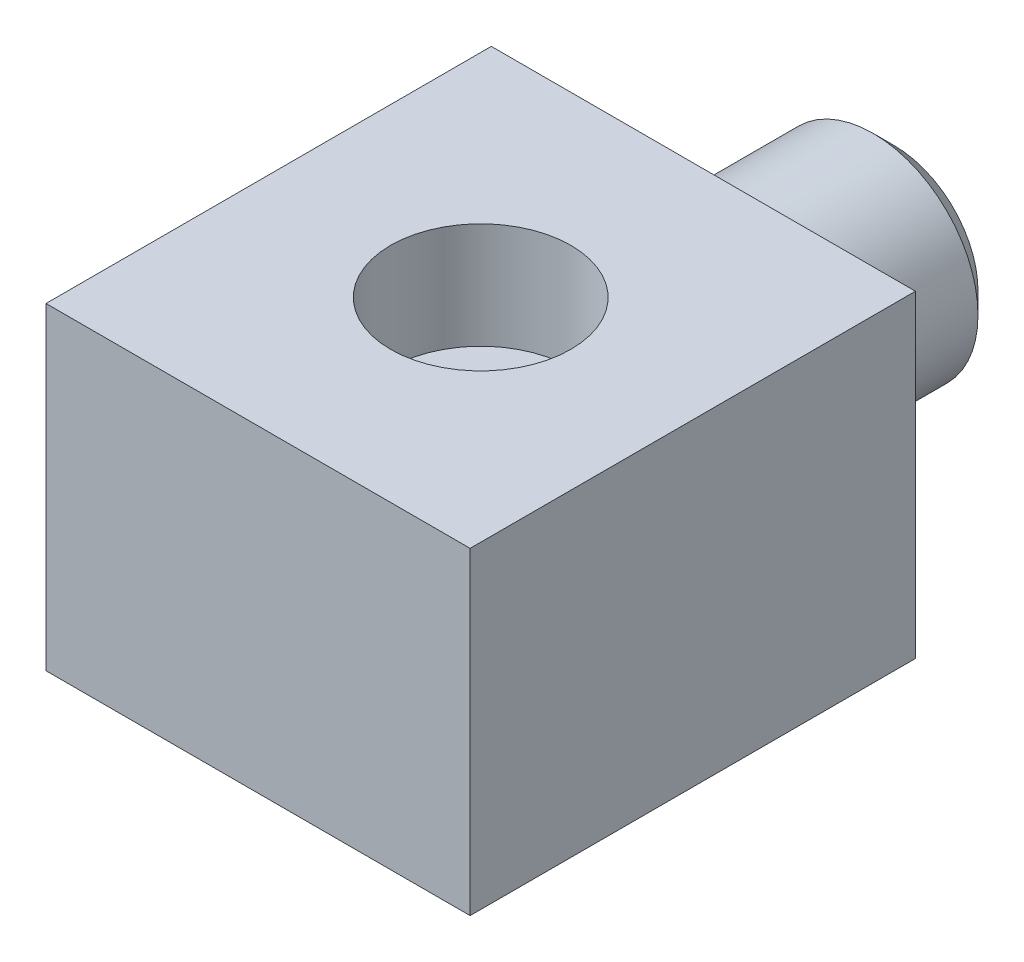
ISO-10303-21;
HEADER;
FILE_DESCRIPTION(('STEP AP214'),'2;1');
FILE_NAME('part.step','',(''),(''),'','','');
FILE_SCHEMA(('AUTOMOTIVE_DESIGN { 1 0 10303 214 1 1 1 1 }'));
ENDSEC;
DATA;
#1=APPLICATION_CONTEXT('core data for automotive mechanical design processes');
#2=APPLICATION_PROTOCOL_DEFINITION('international standard','automotive_design',2000,#1);
#3=PRODUCT_CONTEXT('',#1,'mechanical');
#4=PRODUCT('Part','Part','',(#3));
#5=PRODUCT_RELATED_PRODUCT_CATEGORY('part','',(#4));
#6=PRODUCT_DEFINITION_FORMATION('','',#4);
#7=PRODUCT_DEFINITION_CONTEXT('part definition',#1,'design');
#8=PRODUCT_DEFINITION('design','',#6,#7);
#9=PRODUCT_DEFINITION_SHAPE('','',#8);
#10=(LENGTH_UNIT() NAMED_UNIT(*) SI_UNIT(.MILLI.,.METRE.));
#11=(NAMED_UNIT(*) PLANE_ANGLE_UNIT() SI_UNIT($,.RADIAN.));
#12=(NAMED_UNIT(*) SI_UNIT($,.STERADIAN.) SOLID_ANGLE_UNIT());
#13=UNCERTAINTY_MEASURE_WITH_UNIT(LENGTH_MEASURE(1.E-05),#10,'distance_accuracy_value','');
#14=(GEOMETRIC_REPRESENTATION_CONTEXT(3) GLOBAL_UNCERTAINTY_ASSIGNED_CONTEXT((#13)) GLOBAL_UNIT_ASSIGNED_CONTEXT((#10,
#11,#12)) REPRESENTATION_CONTEXT('',''));
#15=CARTESIAN_POINT('',(0.,0.,0.));
#16=DIRECTION('',(0.,0.,1.));
#17=DIRECTION('',(1.,0.,0.));
#18=AXIS2_PLACEMENT_3D('',#15,#16,#17);
#19=CARTESIAN_POINT('',(10.,-17.1300488792122,37.16633985513));
#20=DIRECTION('',(0.,1.,0.));
#21=DIRECTION('',(0.,0.,1.));
#22=AXIS2_PLACEMENT_3D('',#19,#20,#21);
#23=CYLINDRICAL_SURFACE('',#22,2.2);
#24=CARTESIAN_POINT('',(10.,-17.1300488792122,37.16633985513));
#25=DIRECTION('',(0.,1.,0.));
#26=DIRECTION('',(0.,0.,1.));
#27=AXIS2_PLACEMENT_3D('',#24,#25,#26);
#28=CIRCLE('',#27,2.2);
#29=CARTESIAN_POINT('',(10.,-17.1300488792122,39.36633985513));
#30=VERTEX_POINT('',#29);
#31=EDGE_CURVE('E106',#30,#30,#28,.T.);
#32=ORIENTED_EDGE('',*,*,#31,.F.);
#33=EDGE_LOOP('',(#32));
#34=FACE_BOUND('',#33,.T.);
#35=CARTESIAN_POINT('',(10.,-7.13004887921215,37.16633985513));
#36=DIRECTION('',(0.,1.,0.));
#37=DIRECTION('',(0.,0.,1.));
#38=AXIS2_PLACEMENT_3D('',#35,#36,#37);
#39=CIRCLE('',#38,2.2);
#40=CARTESIAN_POINT('',(10.,-7.13004887921215,39.36633985513));
#41=VERTEX_POINT('',#40);
#42=EDGE_CURVE('E38',#41,#41,#39,.F.);
#43=ORIENTED_EDGE('',*,*,#42,.F.);
#44=EDGE_LOOP('',(#43));
#45=FACE_BOUND('',#44,.T.);
#46=ADVANCED_FACE('F34',(#34,#45),#23,.F.);
#47=CARTESIAN_POINT('',(20.,-2.13004887921215,26.66633985513));
#48=DIRECTION('',(0.,0.,1.));
#49=DIRECTION('',(0.,-1.,0.));
#50=AXIS2_PLACEMENT_3D('',#47,#48,#49);
#51=PLANE('',#50);
#52=CARTESIAN_POINT('',(10.,-9.63004887921215,26.66633985513));
#53=DIRECTION('',(0.,0.,-1.));
#54=DIRECTION('',(0.,1.,0.));
#55=AXIS2_PLACEMENT_3D('',#52,#53,#54);
#56=CIRCLE('',#55,4.95);
#57=CARTESIAN_POINT('',(10.,-4.68004887921215,26.66633985513));
#58=VERTEX_POINT('',#57);
#59=EDGE_CURVE('E113',#58,#58,#56,.T.);
#60=ORIENTED_EDGE('',*,*,#59,.F.);
#61=EDGE_LOOP('',(#60));
#62=FACE_BOUND('',#61,.T.);
#63=DIRECTION('',(0.,1.,0.));
#64=VECTOR('',#63,1.);
#65=CARTESIAN_POINT('',(0.,-2.13004887921215,26.66633985513));
#66=LINE('',#65,#64);
#67=CARTESIAN_POINT('',(0.,-17.1300488792121,26.66633985513));
#68=VERTEX_POINT('',#67);
#69=CARTESIAN_POINT('',(0.,-2.13004887921215,26.66633985513));
#70=VERTEX_POINT('',#69);
#71=EDGE_CURVE('E103',#68,#70,#66,.T.);
#72=ORIENTED_EDGE('',*,*,#71,.T.);
#73=DIRECTION('',(-1.,0.,0.));
#74=VECTOR('',#73,1.);
#75=CARTESIAN_POINT('',(20.,-2.13004887921215,26.66633985513));
#76=LINE('',#75,#74);
#77=CARTESIAN_POINT('',(20.,-2.13004887921215,26.66633985513));
#78=VERTEX_POINT('',#77);
#79=EDGE_CURVE('E94',#78,#70,#76,.T.);
#80=ORIENTED_EDGE('',*,*,#79,.F.);
#81=DIRECTION('',(0.,1.,0.));
#82=VECTOR('',#81,1.);
#83=CARTESIAN_POINT('',(20.,-2.13004887921215,26.66633985513));
#84=LINE('',#83,#82);
#85=CARTESIAN_POINT('',(20.,-17.1300488792121,26.66633985513));
#86=VERTEX_POINT('',#85);
#87=EDGE_CURVE('E88',#86,#78,#84,.T.);
#88=ORIENTED_EDGE('',*,*,#87,.F.);
#89=DIRECTION('',(-1.,0.,0.));
#90=VECTOR('',#89,1.);
#91=CARTESIAN_POINT('',(20.,-17.1300488792121,26.66633985513));
#92=LINE('',#91,#90);
#93=EDGE_CURVE('E99',#86,#68,#92,.T.);
#94=ORIENTED_EDGE('',*,*,#93,.T.);
#95=EDGE_LOOP('',(#72,#80,#88,#94));
#96=FACE_BOUND('',#95,.T.);
#97=ADVANCED_FACE('F137',(#62,#96),#51,.F.);
#98=CARTESIAN_POINT('',(20.,-2.13004887921215,26.66633985513));
#99=DIRECTION('',(0.,-1.,0.));
#100=DIRECTION('',(0.,0.,-1.));
#101=AXIS2_PLACEMENT_3D('',#98,#99,#100);
#102=PLANE('',#101);
#103=CARTESIAN_POINT('',(10.,-2.13004887921215,37.16633985513));
#104=DIRECTION('',(0.,1.,0.));
#105=DIRECTION('',(0.,0.,1.));
#106=AXIS2_PLACEMENT_3D('',#103,#104,#105);
#107=CIRCLE('',#106,4.25);
#108=CARTESIAN_POINT('',(10.,-2.13004887921215,41.41633985513));
#109=VERTEX_POINT('',#108);
#110=EDGE_CURVE('E124',#109,#109,#107,.T.);
#111=ORIENTED_EDGE('',*,*,#110,.F.);
#112=EDGE_LOOP('',(#111));
#113=FACE_BOUND('',#112,.T.);
#114=DIRECTION('',(0.,0.,1.));
#115=VECTOR('',#114,1.);
#116=CARTESIAN_POINT('',(0.,-2.13004887921215,26.66633985513));
#117=LINE('',#116,#115);
#118=CARTESIAN_POINT('',(0.,-2.13004887921215,47.66633985513));
#119=VERTEX_POINT('',#118);
#120=EDGE_CURVE('E93',#70,#119,#117,.T.);
#121=ORIENTED_EDGE('',*,*,#120,.T.);
#122=DIRECTION('',(-1.,0.,0.));
#123=VECTOR('',#122,1.);
#124=CARTESIAN_POINT('',(20.,-2.13004887921215,47.66633985513));
#125=LINE('',#124,#123);
#126=CARTESIAN_POINT('',(20.,-2.13004887921215,47.66633985513));
#127=VERTEX_POINT('',#126);
#128=EDGE_CURVE('E91',#127,#119,#125,.T.);
#129=ORIENTED_EDGE('',*,*,#128,.F.);
#130=DIRECTION('',(0.,0.,1.));
#131=VECTOR('',#130,1.);
#132=CARTESIAN_POINT('',(20.,-2.13004887921215,26.66633985513));
#133=LINE('',#132,#131);
#134=EDGE_CURVE('E83',#78,#127,#133,.T.);
#135=ORIENTED_EDGE('',*,*,#134,.F.);
#136=ORIENTED_EDGE('',*,*,#79,.T.);
#137=EDGE_LOOP('',(#121,#129,#135,#136));
#138=FACE_BOUND('',#137,.T.);
#139=ADVANCED_FACE('F92',(#113,#138),#102,.F.);
#140=CARTESIAN_POINT('',(20.,-2.13004887921215,47.66633985513));
#141=DIRECTION('',(0.,0.,-1.));
#142=DIRECTION('',(-1.,0.,0.));
#143=AXIS2_PLACEMENT_3D('',#140,#141,#142);
#144=PLANE('',#143);
#145=DIRECTION('',(0.,-1.,0.));
#146=VECTOR('',#145,1.);
#147=CARTESIAN_POINT('',(0.,-2.13004887921215,47.66633985513));
#148=LINE('',#147,#146);
#149=CARTESIAN_POINT('',(0.,-17.1300488792121,47.66633985513));
#150=VERTEX_POINT('',#149);
#151=EDGE_CURVE('E69',#119,#150,#148,.T.);
#152=ORIENTED_EDGE('',*,*,#151,.T.);
#153=DIRECTION('',(-1.,0.,0.));
#154=VECTOR('',#153,1.);
#155=CARTESIAN_POINT('',(20.,-17.1300488792121,47.66633985513));
#156=LINE('',#155,#154);
#157=CARTESIAN_POINT('',(20.,-17.1300488792121,47.66633985513));
#158=VERTEX_POINT('',#157);
#159=EDGE_CURVE('E95',#158,#150,#156,.T.);
#160=ORIENTED_EDGE('',*,*,#159,.F.);
#161=DIRECTION('',(0.,-1.,0.));
#162=VECTOR('',#161,1.);
#163=CARTESIAN_POINT('',(20.,-2.13004887921215,47.66633985513));
#164=LINE('',#163,#162);
#165=EDGE_CURVE('E86',#127,#158,#164,.T.);
#166=ORIENTED_EDGE('',*,*,#165,.F.);
#167=ORIENTED_EDGE('',*,*,#128,.T.);
#168=EDGE_LOOP('',(#152,#160,#166,#167));
#169=FACE_BOUND('',#168,.T.);
#170=ADVANCED_FACE('F97',(#169),#144,.F.);
#171=CARTESIAN_POINT('',(20.,-17.1300488792121,26.66633985513));
#172=DIRECTION('',(0.,1.,0.));
#173=DIRECTION('',(0.,0.,1.));
#174=AXIS2_PLACEMENT_3D('',#171,#172,#173);
#175=PLANE('',#174);
#176=ORIENTED_EDGE('',*,*,#31,.T.);
#177=EDGE_LOOP('',(#176));
#178=FACE_BOUND('',#177,.T.);
#179=DIRECTION('',(0.,0.,-1.));
#180=VECTOR('',#179,1.);
#181=CARTESIAN_POINT('',(0.,-17.1300488792121,26.66633985513));
#182=LINE('',#181,#180);
#183=EDGE_CURVE('E75',#150,#68,#182,.T.);
#184=ORIENTED_EDGE('',*,*,#183,.T.);
#185=ORIENTED_EDGE('',*,*,#93,.F.);
#186=DIRECTION('',(0.,0.,-1.));
#187=VECTOR('',#186,1.);
#188=CARTESIAN_POINT('',(20.,-17.1300488792121,26.66633985513));
#189=LINE('',#188,#187);
#190=EDGE_CURVE('E52',#158,#86,#189,.T.);
#191=ORIENTED_EDGE('',*,*,#190,.F.);
#192=ORIENTED_EDGE('',*,*,#159,.T.);
#193=EDGE_LOOP('',(#184,#185,#191,#192));
#194=FACE_BOUND('',#193,.T.);
#195=ADVANCED_FACE('F159',(#178,#194),#175,.F.);
#196=CARTESIAN_POINT('',(20.,0.,0.));
#197=DIRECTION('',(-1.,0.,0.));
#198=DIRECTION('',(0.,0.,1.));
#199=AXIS2_PLACEMENT_3D('',#196,#197,#198);
#200=PLANE('',#199);
#201=ORIENTED_EDGE('',*,*,#87,.T.);
#202=ORIENTED_EDGE('',*,*,#134,.T.);
#203=ORIENTED_EDGE('',*,*,#165,.T.);
#204=ORIENTED_EDGE('',*,*,#190,.T.);
#205=EDGE_LOOP('',(#201,#202,#203,#204));
#206=FACE_BOUND('',#205,.T.);
#207=ADVANCED_FACE('F84',(#206),#200,.F.);
#208=CARTESIAN_POINT('',(0.,0.,0.));
#209=DIRECTION('',(-1.,0.,0.));
#210=DIRECTION('',(0.,0.,1.));
#211=AXIS2_PLACEMENT_3D('',#208,#209,#210);
#212=PLANE('',#211);
#213=ORIENTED_EDGE('',*,*,#71,.F.);
#214=ORIENTED_EDGE('',*,*,#183,.F.);
#215=ORIENTED_EDGE('',*,*,#151,.F.);
#216=ORIENTED_EDGE('',*,*,#120,.F.);
#217=EDGE_LOOP('',(#213,#214,#215,#216));
#218=FACE_BOUND('',#217,.T.);
#219=ADVANCED_FACE('F155',(#218),#212,.T.);
#220=CARTESIAN_POINT('',(10.,-9.63004887921215,17.66633985513));
#221=DIRECTION('',(0.,0.,1.));
#222=DIRECTION('',(0.,-1.,0.));
#223=AXIS2_PLACEMENT_3D('',#220,#221,#222);
#224=CYLINDRICAL_SURFACE('',#223,4.95);
#225=CARTESIAN_POINT('',(10.,-9.63004887921215,18.66633985513));
#226=DIRECTION('',(0.,0.,-1.));
#227=DIRECTION('',(-1.,0.,0.));
#228=AXIS2_PLACEMENT_3D('',#225,#226,#227);
#229=CIRCLE('',#228,4.95);
#230=CARTESIAN_POINT('',(5.05,-9.63004887921215,18.66633985513));
#231=VERTEX_POINT('',#230);
#232=EDGE_CURVE('E11',#231,#231,#229,.F.);
#233=ORIENTED_EDGE('',*,*,#232,.T.);
#234=EDGE_LOOP('',(#233));
#235=FACE_BOUND('',#234,.T.);
#236=ORIENTED_EDGE('',*,*,#59,.T.);
#237=EDGE_LOOP('',(#236));
#238=FACE_BOUND('',#237,.T.);
#239=ADVANCED_FACE('F152',(#235,#238),#224,.T.);
#240=CARTESIAN_POINT('',(10.,-9.63004887921215,17.66633985513));
#241=DIRECTION('',(0.,0.,-1.));
#242=DIRECTION('',(0.,1.,0.));
#243=AXIS2_PLACEMENT_3D('',#240,#241,#242);
#244=PLANE('',#243);
#245=CARTESIAN_POINT('',(10.,-9.63004887921215,17.66633985513));
#246=DIRECTION('',(0.,0.,-1.));
#247=DIRECTION('',(0.,1.,0.));
#248=AXIS2_PLACEMENT_3D('',#245,#246,#247);
#249=CIRCLE('',#248,3.94999999999999);
#250=CARTESIAN_POINT('',(10.,-5.68004887921215,17.66633985513));
#251=VERTEX_POINT('',#250);
#252=EDGE_CURVE('E44',#251,#251,#249,.T.);
#253=ORIENTED_EDGE('',*,*,#252,.T.);
#254=EDGE_LOOP('',(#253));
#255=FACE_BOUND('',#254,.T.);
#256=ADVANCED_FACE('F149',(#255),#244,.T.);
#257=CARTESIAN_POINT('',(10.,-9.63004887921215,17.66633985513));
#258=DIRECTION('',(0.,0.,1.));
#259=DIRECTION('',(1.,0.,0.));
#260=AXIS2_PLACEMENT_3D('',#257,#258,#259);
#261=CONICAL_SURFACE('',#260,3.94999999999999,0.78539816339745);
#262=ORIENTED_EDGE('',*,*,#232,.F.);
#263=EDGE_LOOP('',(#262));
#264=FACE_BOUND('',#263,.T.);
#265=ORIENTED_EDGE('',*,*,#252,.F.);
#266=EDGE_LOOP('',(#265));
#267=FACE_BOUND('',#266,.T.);
#268=ADVANCED_FACE('F36',(#264,#267),#261,.T.);
#269=CARTESIAN_POINT('',(10.,-7.13004887921215,37.16633985513));
#270=DIRECTION('',(0.,1.,0.));
#271=DIRECTION('',(0.,0.,1.));
#272=AXIS2_PLACEMENT_3D('',#269,#270,#271);
#273=PLANE('',#272);
#274=CARTESIAN_POINT('',(10.,-7.13004887921215,37.16633985513));
#275=DIRECTION('',(0.,1.,0.));
#276=DIRECTION('',(0.,0.,1.));
#277=AXIS2_PLACEMENT_3D('',#274,#275,#276);
#278=CIRCLE('',#277,4.25);
#279=CARTESIAN_POINT('',(10.,-7.13004887921215,41.41633985513));
#280=VERTEX_POINT('',#279);
#281=EDGE_CURVE('E127',#280,#280,#278,.T.);
#282=ORIENTED_EDGE('',*,*,#281,.T.);
#283=EDGE_LOOP('',(#282));
#284=FACE_BOUND('',#283,.T.);
#285=ORIENTED_EDGE('',*,*,#42,.T.);
#286=EDGE_LOOP('',(#285));
#287=FACE_BOUND('',#286,.T.);
#288=ADVANCED_FACE('F134',(#284,#287),#273,.T.);
#289=CARTESIAN_POINT('',(10.,-7.13004887921215,37.16633985513));
#290=DIRECTION('',(0.,1.,0.));
#291=DIRECTION('',(0.,0.,1.));
#292=AXIS2_PLACEMENT_3D('',#289,#290,#291);
#293=CYLINDRICAL_SURFACE('',#292,4.25);
#294=ORIENTED_EDGE('',*,*,#281,.F.);
#295=EDGE_LOOP('',(#294));
#296=FACE_BOUND('',#295,.T.);
#297=ORIENTED_EDGE('',*,*,#110,.T.);
#298=EDGE_LOOP('',(#297));
#299=FACE_BOUND('',#298,.T.);
#300=ADVANCED_FACE('F147',(#296,#299),#293,.F.);
#301=CLOSED_SHELL('',(#46,#97,#139,#170,#195,#207,#219,#239,#256,#268,#288,#300));
#302=MANIFOLD_SOLID_BREP('B2',#301);
#303=ADVANCED_BREP_SHAPE_REPRESENTATION('',(#18,#302),#14);
#304=SHAPE_DEFINITION_REPRESENTATION(#9,#303);
ENDSEC;
END-ISO-10303-21;
